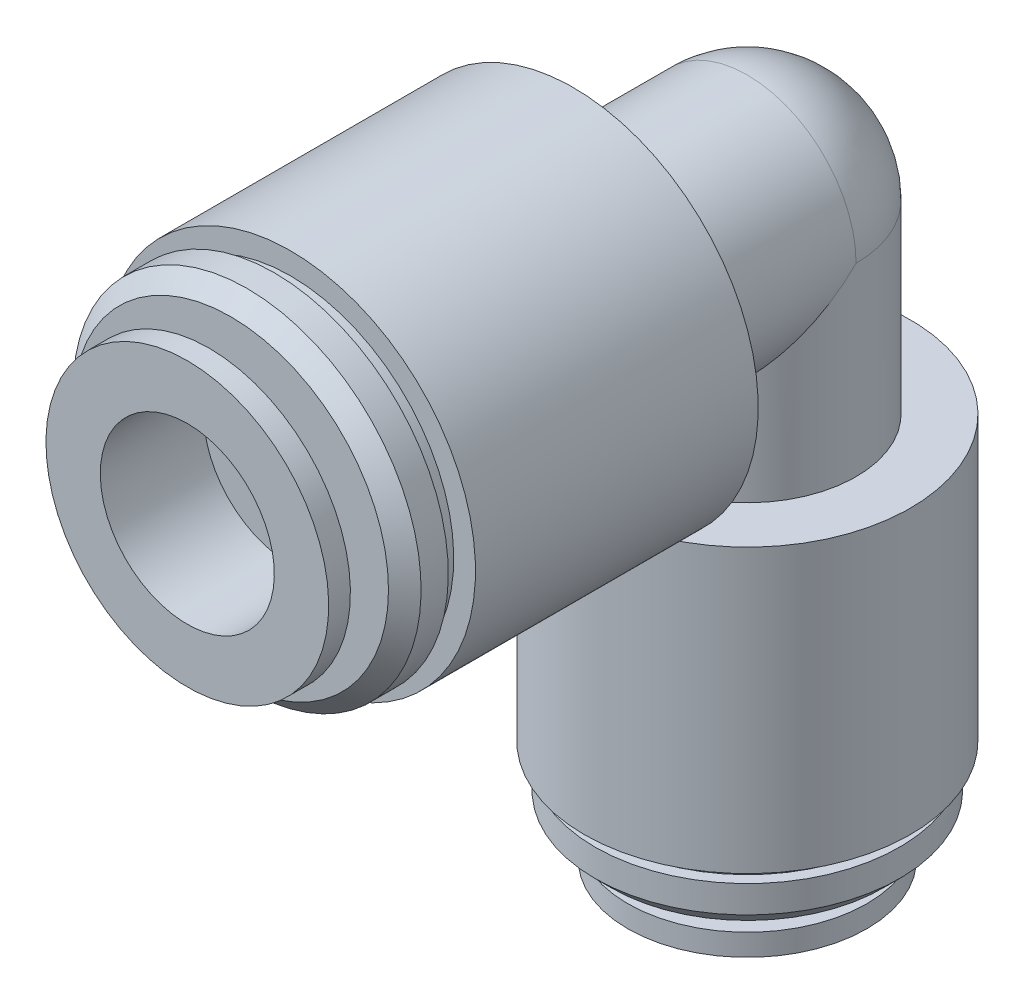
ISO-10303-21;
HEADER;
FILE_DESCRIPTION(('STEP AP214'),'2;1');
FILE_NAME('part.step','',(''),(''),'','','');
FILE_SCHEMA(('AUTOMOTIVE_DESIGN { 1 0 10303 214 1 1 1 1 }'));
ENDSEC;
DATA;
#1=APPLICATION_CONTEXT('core data for automotive mechanical design processes');
#2=APPLICATION_PROTOCOL_DEFINITION('international standard','automotive_design',2000,#1);
#3=PRODUCT_CONTEXT('',#1,'mechanical');
#4=PRODUCT('Part','Part','',(#3));
#5=PRODUCT_RELATED_PRODUCT_CATEGORY('part','',(#4));
#6=PRODUCT_DEFINITION_FORMATION('','',#4);
#7=PRODUCT_DEFINITION_CONTEXT('part definition',#1,'design');
#8=PRODUCT_DEFINITION('design','',#6,#7);
#9=PRODUCT_DEFINITION_SHAPE('','',#8);
#10=(LENGTH_UNIT() NAMED_UNIT(*) SI_UNIT(.MILLI.,.METRE.));
#11=(NAMED_UNIT(*) PLANE_ANGLE_UNIT() SI_UNIT($,.RADIAN.));
#12=(NAMED_UNIT(*) SI_UNIT($,.STERADIAN.) SOLID_ANGLE_UNIT());
#13=UNCERTAINTY_MEASURE_WITH_UNIT(LENGTH_MEASURE(1.E-05),#10,'distance_accuracy_value','');
#14=(GEOMETRIC_REPRESENTATION_CONTEXT(3) GLOBAL_UNCERTAINTY_ASSIGNED_CONTEXT((#13)) GLOBAL_UNIT_ASSIGNED_CONTEXT((#10,
#11,#12)) REPRESENTATION_CONTEXT('',''));
#15=CARTESIAN_POINT('',(0.,0.,0.));
#16=DIRECTION('',(0.,0.,1.));
#17=DIRECTION('',(1.,0.,0.));
#18=AXIS2_PLACEMENT_3D('',#15,#16,#17);
#19=CARTESIAN_POINT('',(0.,25.,0.));
#20=DIRECTION('',(0.,-1.,0.));
#21=DIRECTION('',(0.,0.,-1.));
#22=AXIS2_PLACEMENT_3D('',#19,#20,#21);
#23=CYLINDRICAL_SURFACE('',#22,5.);
#24=CARTESIAN_POINT('',(0.,30.,0.));
#25=DIRECTION('',(0.,-1.,0.));
#26=DIRECTION('',(0.,0.,-1.));
#27=AXIS2_PLACEMENT_3D('',#24,#25,#26);
#28=CIRCLE('',#27,5.);
#29=CARTESIAN_POINT('',(-5.,30.,0.));
#30=VERTEX_POINT('',#29);
#31=CARTESIAN_POINT('',(5.,30.,0.));
#32=VERTEX_POINT('',#31);
#33=EDGE_CURVE('E11',#30,#32,#28,.T.);
#34=ORIENTED_EDGE('',*,*,#33,.T.);
#35=CARTESIAN_POINT('',(0.,30.,0.));
#36=DIRECTION('',(0.,-0.707106781186547,-0.707106781186547));
#37=DIRECTION('',(0.,-0.707106781186547,0.707106781186547));
#38=AXIS2_PLACEMENT_3D('',#35,#36,#37);
#39=ELLIPSE('',#38,7.07106781186547,5.);
#40=EDGE_CURVE('E41',#32,#30,#39,.T.);
#41=ORIENTED_EDGE('',*,*,#40,.T.);
#42=EDGE_LOOP('',(#34,#41));
#43=FACE_BOUND('',#42,.T.);
#44=CARTESIAN_POINT('',(0.,21.5,0.));
#45=DIRECTION('',(0.,-1.,0.));
#46=DIRECTION('',(0.,0.,-1.));
#47=AXIS2_PLACEMENT_3D('',#44,#45,#46);
#48=CIRCLE('',#47,5.);
#49=CARTESIAN_POINT('',(0.,21.5,-5.));
#50=VERTEX_POINT('',#49);
#51=EDGE_CURVE('E248',#50,#50,#48,.T.);
#52=ORIENTED_EDGE('',*,*,#51,.F.);
#53=EDGE_LOOP('',(#52));
#54=FACE_BOUND('',#53,.T.);
#55=ADVANCED_FACE('F34',(#43,#54),#23,.T.);
#56=CARTESIAN_POINT('',(0.,30.,0.));
#57=DIRECTION('',(0.,-1.,0.));
#58=DIRECTION('',(1.,0.,0.));
#59=AXIS2_PLACEMENT_3D('',#56,#57,#58);
#60=SPHERICAL_SURFACE('',#59,5.);
#61=ORIENTED_EDGE('',*,*,#33,.F.);
#62=CARTESIAN_POINT('',(0.,30.,0.));
#63=DIRECTION('',(0.,0.,1.));
#64=DIRECTION('',(1.,0.,0.));
#65=AXIS2_PLACEMENT_3D('',#62,#63,#64);
#66=CIRCLE('',#65,5.);
#67=EDGE_CURVE('E48',#32,#30,#66,.T.);
#68=ORIENTED_EDGE('',*,*,#67,.F.);
#69=EDGE_LOOP('',(#61,#68));
#70=FACE_BOUND('',#69,.T.);
#71=ADVANCED_FACE('F58',(#70),#60,.T.);
#72=CARTESIAN_POINT('',(0.,30.,8.));
#73=DIRECTION('',(0.,0.,-1.));
#74=DIRECTION('',(-1.,0.,0.));
#75=AXIS2_PLACEMENT_3D('',#72,#73,#74);
#76=CYLINDRICAL_SURFACE('',#75,5.);
#77=ORIENTED_EDGE('',*,*,#40,.F.);
#78=ORIENTED_EDGE('',*,*,#67,.T.);
#79=EDGE_LOOP('',(#77,#78));
#80=FACE_BOUND('',#79,.T.);
#81=CARTESIAN_POINT('',(0.,30.,8.));
#82=DIRECTION('',(0.,0.,1.));
#83=DIRECTION('',(1.,0.,0.));
#84=AXIS2_PLACEMENT_3D('',#81,#82,#83);
#85=CIRCLE('',#84,5.);
#86=CARTESIAN_POINT('',(5.,30.,8.));
#87=VERTEX_POINT('',#86);
#88=EDGE_CURVE('E53',#87,#87,#85,.T.);
#89=ORIENTED_EDGE('',*,*,#88,.F.);
#90=EDGE_LOOP('',(#89));
#91=FACE_BOUND('',#90,.T.);
#92=ADVANCED_FACE('F49',(#80,#91),#76,.T.);
#93=CARTESIAN_POINT('',(0.,30.,21.));
#94=DIRECTION('',(0.,0.,-1.));
#95=DIRECTION('',(-1.,0.,0.));
#96=AXIS2_PLACEMENT_3D('',#93,#94,#95);
#97=CYLINDRICAL_SURFACE('',#96,8.5);
#98=CARTESIAN_POINT('',(0.,30.,21.));
#99=DIRECTION('',(0.,0.,1.));
#100=DIRECTION('',(1.,0.,0.));
#101=AXIS2_PLACEMENT_3D('',#98,#99,#100);
#102=CIRCLE('',#101,8.5);
#103=CARTESIAN_POINT('',(-8.5,30.,21.));
#104=VERTEX_POINT('',#103);
#105=EDGE_CURVE('E54',#104,#104,#102,.T.);
#106=CARTESIAN_POINT('',(0.,30.,8.));
#107=DIRECTION('',(0.,0.,1.));
#108=DIRECTION('',(1.,0.,0.));
#109=AXIS2_PLACEMENT_3D('',#106,#107,#108);
#110=CIRCLE('',#109,8.5);
#111=CARTESIAN_POINT('',(-8.5,30.,8.));
#112=VERTEX_POINT('',#111);
#113=EDGE_CURVE('E253',#112,#112,#110,.T.);
#114=CARTESIAN_POINT('',(-8.5,30.,21.));
#115=CARTESIAN_POINT('',(-8.5,30.,20.8645833333333));
#116=CARTESIAN_POINT('',(-8.5,30.,20.7291666666667));
#117=CARTESIAN_POINT('',(-8.5,30.,20.4583333333333));
#118=CARTESIAN_POINT('',(-8.5,30.,20.3229166666667));
#119=CARTESIAN_POINT('',(-8.5,30.,20.0520833333333));
#120=CARTESIAN_POINT('',(-8.5,30.,19.9166666666667));
#121=CARTESIAN_POINT('',(-8.5,30.,19.6458333333333));
#122=CARTESIAN_POINT('',(-8.5,30.,19.5104166666667));
#123=CARTESIAN_POINT('',(-8.5,30.,19.2395833333333));
#124=CARTESIAN_POINT('',(-8.5,30.,19.1041666666667));
#125=CARTESIAN_POINT('',(-8.5,30.,18.8333333333333));
#126=CARTESIAN_POINT('',(-8.5,30.,18.6979166666667));
#127=CARTESIAN_POINT('',(-8.5,30.,18.4270833333333));
#128=CARTESIAN_POINT('',(-8.5,30.,18.2916666666667));
#129=CARTESIAN_POINT('',(-8.5,30.,18.0208333333333));
#130=CARTESIAN_POINT('',(-8.5,30.,17.8854166666667));
#131=CARTESIAN_POINT('',(-8.5,30.,17.6145833333333));
#132=CARTESIAN_POINT('',(-8.5,30.,17.4791666666667));
#133=CARTESIAN_POINT('',(-8.5,30.,17.2083333333333));
#134=CARTESIAN_POINT('',(-8.5,30.,17.0729166666667));
#135=CARTESIAN_POINT('',(-8.5,30.,16.8020833333333));
#136=CARTESIAN_POINT('',(-8.5,30.,16.6666666666667));
#137=CARTESIAN_POINT('',(-8.5,30.,16.3958333333333));
#138=CARTESIAN_POINT('',(-8.5,30.,16.2604166666667));
#139=CARTESIAN_POINT('',(-8.5,30.,15.9895833333333));
#140=CARTESIAN_POINT('',(-8.5,30.,15.8541666666667));
#141=CARTESIAN_POINT('',(-8.5,30.,15.5833333333333));
#142=CARTESIAN_POINT('',(-8.5,30.,15.4479166666667));
#143=CARTESIAN_POINT('',(-8.5,30.,15.1770833333333));
#144=CARTESIAN_POINT('',(-8.5,30.,15.0416666666667));
#145=CARTESIAN_POINT('',(-8.5,30.,14.7708333333333));
#146=CARTESIAN_POINT('',(-8.5,30.,14.6354166666667));
#147=CARTESIAN_POINT('',(-8.5,30.,14.3645833333333));
#148=CARTESIAN_POINT('',(-8.5,30.,14.2291666666667));
#149=CARTESIAN_POINT('',(-8.5,30.,13.9583333333333));
#150=CARTESIAN_POINT('',(-8.5,30.,13.8229166666667));
#151=CARTESIAN_POINT('',(-8.5,30.,13.5520833333333));
#152=CARTESIAN_POINT('',(-8.5,30.,13.4166666666667));
#153=CARTESIAN_POINT('',(-8.5,30.,13.1458333333333));
#154=CARTESIAN_POINT('',(-8.5,30.,13.0104166666667));
#155=CARTESIAN_POINT('',(-8.5,30.,12.7395833333333));
#156=CARTESIAN_POINT('',(-8.5,30.,12.6041666666667));
#157=CARTESIAN_POINT('',(-8.5,30.,12.3333333333333));
#158=CARTESIAN_POINT('',(-8.5,30.,12.1979166666667));
#159=CARTESIAN_POINT('',(-8.5,30.,11.9270833333333));
#160=CARTESIAN_POINT('',(-8.5,30.,11.7916666666667));
#161=CARTESIAN_POINT('',(-8.5,30.,11.5208333333333));
#162=CARTESIAN_POINT('',(-8.5,30.,11.3854166666667));
#163=CARTESIAN_POINT('',(-8.5,30.,11.1145833333333));
#164=CARTESIAN_POINT('',(-8.5,30.,10.9791666666667));
#165=CARTESIAN_POINT('',(-8.5,30.,10.7083333333333));
#166=CARTESIAN_POINT('',(-8.5,30.,10.5729166666667));
#167=CARTESIAN_POINT('',(-8.5,30.,10.3020833333333));
#168=CARTESIAN_POINT('',(-8.5,30.,10.1666666666667));
#169=CARTESIAN_POINT('',(-8.5,30.,9.89583333333333));
#170=CARTESIAN_POINT('',(-8.5,30.,9.76041666666667));
#171=CARTESIAN_POINT('',(-8.5,30.,9.48958333333333));
#172=CARTESIAN_POINT('',(-8.5,30.,9.35416666666666));
#173=CARTESIAN_POINT('',(-8.5,30.,9.08333333333333));
#174=CARTESIAN_POINT('',(-8.5,30.,8.94791666666666));
#175=CARTESIAN_POINT('',(-8.5,30.,8.67708333333333));
#176=CARTESIAN_POINT('',(-8.5,30.,8.54166666666667));
#177=CARTESIAN_POINT('',(-8.5,30.,8.27083333333333));
#178=CARTESIAN_POINT('',(-8.5,30.,8.13541666666667));
#179=CARTESIAN_POINT('',(-8.5,30.,8.));
#180=B_SPLINE_CURVE_WITH_KNOTS('',3,(#114,#115,#116,#117,#118,#119,#120,#121,#122,#123,#124,
#125,#126,#127,#128,#129,#130,#131,#132,#133,#134,#135,#136,#137,#138,#139,#140,#141,#142,#143,
#144,#145,#146,#147,#148,#149,#150,#151,#152,#153,#154,#155,#156,#157,#158,#159,#160,#161,#162,
#163,#164,#165,#166,#167,#168,#169,#170,#171,#172,#173,#174,#175,#176,#177,#178,#179),
.UNSPECIFIED.,.F.,.F.,(4,2,2,2,2,2,2,2,2,2,2,2,2,2,2,2,2,2,2,2,2,2,2,2,2,2,2,2,2,2,2,2,4),(0.,
0.406249999999997,0.812499999999997,1.21875,1.625,2.03125,2.4375,2.84375,3.25,3.65625,4.0625,
4.46875,4.875,5.28125,5.6875,6.09375,6.5,6.90625,7.3125,7.71875,8.125,8.53124999999999,8.9375,
9.34375,9.75,10.15625,10.5625,10.96875,11.375,11.78125,12.1875,12.59375,13.),.UNSPECIFIED.);
#181=EDGE_CURVE('BSEAM64',#104,#112,#180,.T.);
#182=ORIENTED_EDGE('',*,*,#105,.F.);
#183=ORIENTED_EDGE('',*,*,#113,.T.);
#184=ORIENTED_EDGE('',*,*,#181,.T.);
#185=ORIENTED_EDGE('',*,*,#181,.F.);
#186=EDGE_LOOP('',(#182,#184,#183,#185));
#187=FACE_BOUND('',#186,.T.);
#188=ADVANCED_FACE('F64',(#187),#97,.T.);
#189=CARTESIAN_POINT('',(0.,30.,21.));
#190=DIRECTION('',(0.,0.,1.));
#191=DIRECTION('',(1.,0.,0.));
#192=AXIS2_PLACEMENT_3D('',#189,#190,#191);
#193=PLANE('',#192);
#194=CARTESIAN_POINT('',(0.,30.,21.));
#195=DIRECTION('',(0.,0.,-1.));
#196=DIRECTION('',(0.,1.,0.));
#197=AXIS2_PLACEMENT_3D('',#194,#195,#196);
#198=CIRCLE('',#197,7.49999999999996);
#199=CARTESIAN_POINT('',(0.,37.5,21.));
#200=VERTEX_POINT('',#199);
#201=EDGE_CURVE('E178',#200,#200,#198,.T.);
#202=ORIENTED_EDGE('',*,*,#201,.T.);
#203=EDGE_LOOP('',(#202));
#204=FACE_BOUND('',#203,.T.);
#205=ORIENTED_EDGE('',*,*,#105,.T.);
#206=EDGE_LOOP('',(#205));
#207=FACE_BOUND('',#206,.T.);
#208=ADVANCED_FACE('F69',(#204,#207),#193,.T.);
#209=CARTESIAN_POINT('',(0.,30.,8.));
#210=DIRECTION('',(0.,0.,1.));
#211=DIRECTION('',(1.,0.,0.));
#212=AXIS2_PLACEMENT_3D('',#209,#210,#211);
#213=PLANE('',#212);
#214=ORIENTED_EDGE('',*,*,#88,.T.);
#215=EDGE_LOOP('',(#214));
#216=FACE_BOUND('',#215,.T.);
#217=ORIENTED_EDGE('',*,*,#113,.F.);
#218=EDGE_LOOP('',(#217));
#219=FACE_BOUND('',#218,.T.);
#220=ADVANCED_FACE('F71',(#216,#219),#213,.F.);
#221=CARTESIAN_POINT('',(0.,8.5,0.));
#222=DIRECTION('',(0.,1.,0.));
#223=DIRECTION('',(0.,0.,1.));
#224=AXIS2_PLACEMENT_3D('',#221,#222,#223);
#225=CYLINDRICAL_SURFACE('',#224,7.5);
#226=CARTESIAN_POINT('',(0.,8.5,0.));
#227=DIRECTION('',(0.,-1.,0.));
#228=DIRECTION('',(0.,0.,-1.));
#229=AXIS2_PLACEMENT_3D('',#226,#227,#228);
#230=CIRCLE('',#229,7.5);
#231=CARTESIAN_POINT('',(0.,8.5,7.5));
#232=VERTEX_POINT('',#231);
#233=EDGE_CURVE('E245',#232,#232,#230,.T.);
#234=CARTESIAN_POINT('',(0.,21.5,0.));
#235=DIRECTION('',(0.,-1.,0.));
#236=DIRECTION('',(0.,0.,-1.));
#237=AXIS2_PLACEMENT_3D('',#234,#235,#236);
#238=CIRCLE('',#237,7.5);
#239=CARTESIAN_POINT('',(0.,21.5,7.5));
#240=VERTEX_POINT('',#239);
#241=EDGE_CURVE('E244',#240,#240,#238,.T.);
#242=CARTESIAN_POINT('',(0.,8.5,7.5));
#243=CARTESIAN_POINT('',(0.,8.63541666666667,7.5));
#244=CARTESIAN_POINT('',(0.,8.77083333333334,7.5));
#245=CARTESIAN_POINT('',(0.,9.04166666666667,7.5));
#246=CARTESIAN_POINT('',(0.,9.17708333333334,7.5));
#247=CARTESIAN_POINT('',(0.,9.44791666666667,7.5));
#248=CARTESIAN_POINT('',(0.,9.58333333333334,7.5));
#249=CARTESIAN_POINT('',(0.,9.85416666666667,7.5));
#250=CARTESIAN_POINT('',(0.,9.98958333333334,7.5));
#251=CARTESIAN_POINT('',(0.,10.2604166666667,7.5));
#252=CARTESIAN_POINT('',(0.,10.3958333333333,7.5));
#253=CARTESIAN_POINT('',(0.,10.6666666666667,7.5));
#254=CARTESIAN_POINT('',(0.,10.8020833333333,7.5));
#255=CARTESIAN_POINT('',(0.,11.0729166666667,7.5));
#256=CARTESIAN_POINT('',(0.,11.2083333333333,7.5));
#257=CARTESIAN_POINT('',(0.,11.4791666666667,7.5));
#258=CARTESIAN_POINT('',(0.,11.6145833333333,7.5));
#259=CARTESIAN_POINT('',(0.,11.8854166666667,7.5));
#260=CARTESIAN_POINT('',(0.,12.0208333333333,7.5));
#261=CARTESIAN_POINT('',(0.,12.2916666666667,7.5));
#262=CARTESIAN_POINT('',(0.,12.4270833333333,7.5));
#263=CARTESIAN_POINT('',(0.,12.6979166666667,7.5));
#264=CARTESIAN_POINT('',(0.,12.8333333333333,7.5));
#265=CARTESIAN_POINT('',(0.,13.1041666666667,7.5));
#266=CARTESIAN_POINT('',(0.,13.2395833333333,7.5));
#267=CARTESIAN_POINT('',(0.,13.5104166666667,7.5));
#268=CARTESIAN_POINT('',(0.,13.6458333333333,7.5));
#269=CARTESIAN_POINT('',(0.,13.9166666666667,7.5));
#270=CARTESIAN_POINT('',(0.,14.0520833333333,7.5));
#271=CARTESIAN_POINT('',(0.,14.3229166666667,7.5));
#272=CARTESIAN_POINT('',(0.,14.4583333333333,7.5));
#273=CARTESIAN_POINT('',(0.,14.7291666666667,7.5));
#274=CARTESIAN_POINT('',(0.,14.8645833333333,7.5));
#275=CARTESIAN_POINT('',(0.,15.1354166666667,7.5));
#276=CARTESIAN_POINT('',(0.,15.2708333333333,7.5));
#277=CARTESIAN_POINT('',(0.,15.5416666666667,7.5));
#278=CARTESIAN_POINT('',(0.,15.6770833333333,7.5));
#279=CARTESIAN_POINT('',(0.,15.9479166666667,7.5));
#280=CARTESIAN_POINT('',(0.,16.0833333333333,7.5));
#281=CARTESIAN_POINT('',(0.,16.3541666666667,7.5));
#282=CARTESIAN_POINT('',(0.,16.4895833333333,7.5));
#283=CARTESIAN_POINT('',(0.,16.7604166666667,7.5));
#284=CARTESIAN_POINT('',(0.,16.8958333333333,7.5));
#285=CARTESIAN_POINT('',(0.,17.1666666666667,7.5));
#286=CARTESIAN_POINT('',(0.,17.3020833333333,7.5));
#287=CARTESIAN_POINT('',(0.,17.5729166666667,7.5));
#288=CARTESIAN_POINT('',(0.,17.7083333333333,7.5));
#289=CARTESIAN_POINT('',(0.,17.9791666666667,7.5));
#290=CARTESIAN_POINT('',(0.,18.1145833333333,7.5));
#291=CARTESIAN_POINT('',(0.,18.3854166666667,7.5));
#292=CARTESIAN_POINT('',(0.,18.5208333333333,7.5));
#293=CARTESIAN_POINT('',(0.,18.7916666666667,7.5));
#294=CARTESIAN_POINT('',(0.,18.9270833333333,7.5));
#295=CARTESIAN_POINT('',(0.,19.1979166666667,7.5));
#296=CARTESIAN_POINT('',(0.,19.3333333333333,7.5));
#297=CARTESIAN_POINT('',(0.,19.6041666666667,7.5));
#298=CARTESIAN_POINT('',(0.,19.7395833333333,7.5));
#299=CARTESIAN_POINT('',(0.,20.0104166666667,7.5));
#300=CARTESIAN_POINT('',(0.,20.1458333333333,7.5));
#301=CARTESIAN_POINT('',(0.,20.4166666666667,7.5));
#302=CARTESIAN_POINT('',(0.,20.5520833333333,7.5));
#303=CARTESIAN_POINT('',(0.,20.8229166666667,7.5));
#304=CARTESIAN_POINT('',(0.,20.9583333333333,7.5));
#305=CARTESIAN_POINT('',(0.,21.2291666666667,7.5));
#306=CARTESIAN_POINT('',(0.,21.3645833333333,7.5));
#307=CARTESIAN_POINT('',(0.,21.5,7.5));
#308=B_SPLINE_CURVE_WITH_KNOTS('',3,(#242,#243,#244,#245,#246,#247,#248,#249,#250,#251,#252,
#253,#254,#255,#256,#257,#258,#259,#260,#261,#262,#263,#264,#265,#266,#267,#268,#269,#270,#271,
#272,#273,#274,#275,#276,#277,#278,#279,#280,#281,#282,#283,#284,#285,#286,#287,#288,#289,#290,
#291,#292,#293,#294,#295,#296,#297,#298,#299,#300,#301,#302,#303,#304,#305,#306,#307),
.UNSPECIFIED.,.F.,.F.,(4,2,2,2,2,2,2,2,2,2,2,2,2,2,2,2,2,2,2,2,2,2,2,2,2,2,2,2,2,2,2,2,4),(0.,
0.40625,0.812500000000001,1.21875,1.625,2.03125,2.4375,2.84375,3.25,3.65625,4.0625,4.46875,
4.875,5.28125,5.6875,6.09375,6.5,6.90625,7.3125,7.71875,8.125,8.53125,8.9375,9.34375,9.75,
10.15625,10.5625,10.96875,11.375,11.78125,12.1875,12.59375,13.),.UNSPECIFIED.);
#309=EDGE_CURVE('BSEAM74',#232,#240,#308,.T.);
#310=ORIENTED_EDGE('',*,*,#233,.F.);
#311=ORIENTED_EDGE('',*,*,#241,.T.);
#312=ORIENTED_EDGE('',*,*,#309,.T.);
#313=ORIENTED_EDGE('',*,*,#309,.F.);
#314=EDGE_LOOP('',(#310,#312,#311,#313));
#315=FACE_BOUND('',#314,.T.);
#316=ADVANCED_FACE('F74',(#315),#225,.T.);
#317=CARTESIAN_POINT('',(0.,8.5,0.));
#318=DIRECTION('',(0.,-1.,0.));
#319=DIRECTION('',(0.,0.,-1.));
#320=AXIS2_PLACEMENT_3D('',#317,#318,#319);
#321=PLANE('',#320);
#322=CARTESIAN_POINT('',(0.,8.5,0.));
#323=DIRECTION('',(0.,1.,0.));
#324=DIRECTION('',(0.,0.,1.));
#325=AXIS2_PLACEMENT_3D('',#322,#323,#324);
#326=CIRCLE('',#325,6.49999999999996);
#327=CARTESIAN_POINT('',(0.,8.49999999999998,6.49999999999996));
#328=VERTEX_POINT('',#327);
#329=EDGE_CURVE('E214',#328,#328,#326,.T.);
#330=ORIENTED_EDGE('',*,*,#329,.T.);
#331=EDGE_LOOP('',(#330));
#332=FACE_BOUND('',#331,.T.);
#333=ORIENTED_EDGE('',*,*,#233,.T.);
#334=EDGE_LOOP('',(#333));
#335=FACE_BOUND('',#334,.T.);
#336=ADVANCED_FACE('F82',(#332,#335),#321,.T.);
#337=CARTESIAN_POINT('',(0.,21.5,0.));
#338=DIRECTION('',(0.,-1.,0.));
#339=DIRECTION('',(0.,0.,-1.));
#340=AXIS2_PLACEMENT_3D('',#337,#338,#339);
#341=PLANE('',#340);
#342=ORIENTED_EDGE('',*,*,#51,.T.);
#343=EDGE_LOOP('',(#342));
#344=FACE_BOUND('',#343,.T.);
#345=ORIENTED_EDGE('',*,*,#241,.F.);
#346=EDGE_LOOP('',(#345));
#347=FACE_BOUND('',#346,.T.);
#348=ADVANCED_FACE('F84',(#344,#347),#341,.F.);
#349=CARTESIAN_POINT('',(0.,8.5,0.));
#350=DIRECTION('',(0.,1.,0.));
#351=DIRECTION('',(0.,0.,1.));
#352=AXIS2_PLACEMENT_3D('',#349,#350,#351);
#353=CYLINDRICAL_SURFACE('',#352,3.);
#354=CARTESIAN_POINT('',(0.,3.74999999999998,0.));
#355=DIRECTION('',(0.,1.,0.));
#356=DIRECTION('',(0.,0.,1.));
#357=AXIS2_PLACEMENT_3D('',#354,#355,#356);
#358=CIRCLE('',#357,3.);
#359=CARTESIAN_POINT('',(0.,3.74999999999997,2.99999999999999));
#360=VERTEX_POINT('',#359);
#361=EDGE_CURVE('E241',#360,#360,#358,.T.);
#362=ORIENTED_EDGE('',*,*,#361,.F.);
#363=EDGE_LOOP('',(#362));
#364=FACE_BOUND('',#363,.T.);
#365=CARTESIAN_POINT('',(0.,8.50000000000001,0.));
#366=DIRECTION('',(0.,1.,0.));
#367=DIRECTION('',(0.,0.,1.));
#368=AXIS2_PLACEMENT_3D('',#365,#366,#367);
#369=CIRCLE('',#368,3.);
#370=CARTESIAN_POINT('',(0.,8.5,3.));
#371=VERTEX_POINT('',#370);
#372=EDGE_CURVE('E211',#371,#371,#369,.T.);
#373=ORIENTED_EDGE('',*,*,#372,.T.);
#374=EDGE_LOOP('',(#373));
#375=FACE_BOUND('',#374,.T.);
#376=ADVANCED_FACE('F87',(#364,#375),#353,.F.);
#377=CARTESIAN_POINT('',(0.,3.74999999999999,-3.00000000000002));
#378=DIRECTION('',(0.,1.,0.));
#379=DIRECTION('',(0.,0.,1.));
#380=AXIS2_PLACEMENT_3D('',#377,#378,#379);
#381=PLANE('',#380);
#382=CARTESIAN_POINT('',(0.,3.74999999999998,0.));
#383=DIRECTION('',(0.,1.,0.));
#384=DIRECTION('',(0.,0.,1.));
#385=AXIS2_PLACEMENT_3D('',#382,#383,#384);
#386=CIRCLE('',#385,5.5);
#387=CARTESIAN_POINT('',(0.,3.74999999999997,5.49999999999999));
#388=VERTEX_POINT('',#387);
#389=EDGE_CURVE('E238',#388,#388,#386,.T.);
#390=ORIENTED_EDGE('',*,*,#389,.F.);
#391=EDGE_LOOP('',(#390));
#392=FACE_BOUND('',#391,.T.);
#393=ORIENTED_EDGE('',*,*,#361,.T.);
#394=EDGE_LOOP('',(#393));
#395=FACE_BOUND('',#394,.T.);
#396=ADVANCED_FACE('F95',(#392,#395),#381,.F.);
#397=CARTESIAN_POINT('',(0.,8.5,0.));
#398=DIRECTION('',(0.,1.,0.));
#399=DIRECTION('',(0.,0.,1.));
#400=AXIS2_PLACEMENT_3D('',#397,#398,#399);
#401=CYLINDRICAL_SURFACE('',#400,5.5);
#402=CARTESIAN_POINT('',(0.,4.75000000000007,0.));
#403=DIRECTION('',(0.,1.,0.));
#404=DIRECTION('',(0.,0.,1.));
#405=AXIS2_PLACEMENT_3D('',#402,#403,#404);
#406=CIRCLE('',#405,5.5);
#407=CARTESIAN_POINT('',(0.,4.75000000000005,5.49999999999999));
#408=VERTEX_POINT('',#407);
#409=EDGE_CURVE('E235',#408,#408,#406,.T.);
#410=ORIENTED_EDGE('',*,*,#409,.F.);
#411=EDGE_LOOP('',(#410));
#412=FACE_BOUND('',#411,.T.);
#413=ORIENTED_EDGE('',*,*,#389,.T.);
#414=EDGE_LOOP('',(#413));
#415=FACE_BOUND('',#414,.T.);
#416=ADVANCED_FACE('F99',(#412,#415),#401,.T.);
#417=CARTESIAN_POINT('',(0.,4.75000000000008,-5.50000000000001));
#418=DIRECTION('',(0.,-1.,0.));
#419=DIRECTION('',(0.,0.,-1.));
#420=AXIS2_PLACEMENT_3D('',#417,#418,#419);
#421=PLANE('',#420);
#422=CARTESIAN_POINT('',(0.,4.75000000000007,0.));
#423=DIRECTION('',(0.,1.,0.));
#424=DIRECTION('',(0.,0.,1.));
#425=AXIS2_PLACEMENT_3D('',#422,#423,#424);
#426=CIRCLE('',#425,3.49999999999998);
#427=CARTESIAN_POINT('',(0.,4.75000000000006,3.49999999999997));
#428=VERTEX_POINT('',#427);
#429=EDGE_CURVE('E232',#428,#428,#426,.T.);
#430=ORIENTED_EDGE('',*,*,#429,.F.);
#431=EDGE_LOOP('',(#430));
#432=FACE_BOUND('',#431,.T.);
#433=ORIENTED_EDGE('',*,*,#409,.T.);
#434=EDGE_LOOP('',(#433));
#435=FACE_BOUND('',#434,.T.);
#436=ADVANCED_FACE('F103',(#432,#435),#421,.F.);
#437=CARTESIAN_POINT('',(0.,8.5,0.));
#438=DIRECTION('',(0.,1.,0.));
#439=DIRECTION('',(0.,0.,1.));
#440=AXIS2_PLACEMENT_3D('',#437,#438,#439);
#441=CYLINDRICAL_SURFACE('',#440,3.49999999999998);
#442=CARTESIAN_POINT('',(0.,5.75000000000003,0.));
#443=DIRECTION('',(0.,1.,0.));
#444=DIRECTION('',(0.,0.,1.));
#445=AXIS2_PLACEMENT_3D('',#442,#443,#444);
#446=CIRCLE('',#445,3.49999999999998);
#447=CARTESIAN_POINT('',(0.,5.75000000000002,3.49999999999998));
#448=VERTEX_POINT('',#447);
#449=EDGE_CURVE('E229',#448,#448,#446,.T.);
#450=ORIENTED_EDGE('',*,*,#449,.F.);
#451=EDGE_LOOP('',(#450));
#452=FACE_BOUND('',#451,.T.);
#453=ORIENTED_EDGE('',*,*,#429,.T.);
#454=EDGE_LOOP('',(#453));
#455=FACE_BOUND('',#454,.T.);
#456=ADVANCED_FACE('F107',(#452,#455),#441,.T.);
#457=CARTESIAN_POINT('',(0.,5.75000000000004,-3.49999999999999));
#458=DIRECTION('',(0.,1.,0.));
#459=DIRECTION('',(0.,0.,1.));
#460=AXIS2_PLACEMENT_3D('',#457,#458,#459);
#461=PLANE('',#460);
#462=CARTESIAN_POINT('',(0.,5.75000000000003,0.));
#463=DIRECTION('',(0.,1.,0.));
#464=DIRECTION('',(0.,0.,1.));
#465=AXIS2_PLACEMENT_3D('',#462,#463,#464);
#466=CIRCLE('',#465,6.24999999999998);
#467=CARTESIAN_POINT('',(0.,5.75000000000001,6.24999999999997));
#468=VERTEX_POINT('',#467);
#469=EDGE_CURVE('E226',#468,#468,#466,.T.);
#470=ORIENTED_EDGE('',*,*,#469,.F.);
#471=EDGE_LOOP('',(#470));
#472=FACE_BOUND('',#471,.T.);
#473=ORIENTED_EDGE('',*,*,#449,.T.);
#474=EDGE_LOOP('',(#473));
#475=FACE_BOUND('',#474,.T.);
#476=ADVANCED_FACE('F111',(#472,#475),#461,.F.);
#477=CARTESIAN_POINT('',(0.,5.75000000000003,0.));
#478=DIRECTION('',(0.,1.,0.));
#479=DIRECTION('',(0.,0.,1.));
#480=AXIS2_PLACEMENT_3D('',#477,#478,#479);
#481=CONICAL_SURFACE('',#480,6.24999999999998,0.785398163397448);
#482=CARTESIAN_POINT('',(0.,6.50000000000003,0.));
#483=DIRECTION('',(0.,1.,0.));
#484=DIRECTION('',(0.,0.,1.));
#485=AXIS2_PLACEMENT_3D('',#482,#483,#484);
#486=CIRCLE('',#485,6.99999999999998);
#487=CARTESIAN_POINT('',(0.,6.50000000000001,6.99999999999997));
#488=VERTEX_POINT('',#487);
#489=EDGE_CURVE('E223',#488,#488,#486,.T.);
#490=ORIENTED_EDGE('',*,*,#489,.F.);
#491=EDGE_LOOP('',(#490));
#492=FACE_BOUND('',#491,.T.);
#493=ORIENTED_EDGE('',*,*,#469,.T.);
#494=EDGE_LOOP('',(#493));
#495=FACE_BOUND('',#494,.T.);
#496=ADVANCED_FACE('F115',(#492,#495),#481,.T.);
#497=CARTESIAN_POINT('',(0.,8.5,0.));
#498=DIRECTION('',(0.,1.,0.));
#499=DIRECTION('',(0.,0.,1.));
#500=AXIS2_PLACEMENT_3D('',#497,#498,#499);
#501=CYLINDRICAL_SURFACE('',#500,6.99999999999998);
#502=CARTESIAN_POINT('',(0.,7.75000000000001,0.));
#503=DIRECTION('',(0.,1.,0.));
#504=DIRECTION('',(0.,0.,1.));
#505=AXIS2_PLACEMENT_3D('',#502,#503,#504);
#506=CIRCLE('',#505,6.99999999999998);
#507=CARTESIAN_POINT('',(0.,7.74999999999999,6.99999999999998));
#508=VERTEX_POINT('',#507);
#509=EDGE_CURVE('E220',#508,#508,#506,.T.);
#510=ORIENTED_EDGE('',*,*,#509,.F.);
#511=EDGE_LOOP('',(#510));
#512=FACE_BOUND('',#511,.T.);
#513=ORIENTED_EDGE('',*,*,#489,.T.);
#514=EDGE_LOOP('',(#513));
#515=FACE_BOUND('',#514,.T.);
#516=ADVANCED_FACE('F119',(#512,#515),#501,.T.);
#517=CARTESIAN_POINT('',(0.,7.75000000000003,-6.99999999999998));
#518=DIRECTION('',(0.,-1.,0.));
#519=DIRECTION('',(0.,0.,-1.));
#520=AXIS2_PLACEMENT_3D('',#517,#518,#519);
#521=PLANE('',#520);
#522=CARTESIAN_POINT('',(0.,7.75000000000001,0.));
#523=DIRECTION('',(0.,1.,0.));
#524=DIRECTION('',(0.,0.,1.));
#525=AXIS2_PLACEMENT_3D('',#522,#523,#524);
#526=CIRCLE('',#525,6.49999999999996);
#527=CARTESIAN_POINT('',(0.,7.74999999999999,6.49999999999996));
#528=VERTEX_POINT('',#527);
#529=EDGE_CURVE('E217',#528,#528,#526,.T.);
#530=ORIENTED_EDGE('',*,*,#529,.F.);
#531=EDGE_LOOP('',(#530));
#532=FACE_BOUND('',#531,.T.);
#533=ORIENTED_EDGE('',*,*,#509,.T.);
#534=EDGE_LOOP('',(#533));
#535=FACE_BOUND('',#534,.T.);
#536=ADVANCED_FACE('F123',(#532,#535),#521,.F.);
#537=CARTESIAN_POINT('',(0.,8.5,0.));
#538=DIRECTION('',(0.,1.,0.));
#539=DIRECTION('',(0.,0.,1.));
#540=AXIS2_PLACEMENT_3D('',#537,#538,#539);
#541=CYLINDRICAL_SURFACE('',#540,6.49999999999996);
#542=ORIENTED_EDGE('',*,*,#329,.F.);
#543=EDGE_LOOP('',(#542));
#544=FACE_BOUND('',#543,.T.);
#545=ORIENTED_EDGE('',*,*,#529,.T.);
#546=EDGE_LOOP('',(#545));
#547=FACE_BOUND('',#546,.T.);
#548=ADVANCED_FACE('F127',(#544,#547),#541,.T.);
#549=ORIENTED_EDGE('',*,*,#372,.F.);
#550=EDGE_LOOP('',(#549));
#551=FACE_BOUND('',#550,.T.);
#552=ADVANCED_FACE('F92',(#551),#321,.T.);
#553=CARTESIAN_POINT('',(0.,30.,21.));
#554=DIRECTION('',(0.,0.,-1.));
#555=DIRECTION('',(0.,1.,0.));
#556=AXIS2_PLACEMENT_3D('',#553,#554,#555);
#557=CYLINDRICAL_SURFACE('',#556,4.);
#558=CARTESIAN_POINT('',(0.,30.,25.75));
#559=DIRECTION('',(0.,0.,-1.));
#560=DIRECTION('',(0.,1.,0.));
#561=AXIS2_PLACEMENT_3D('',#558,#559,#560);
#562=CIRCLE('',#561,4.);
#563=CARTESIAN_POINT('',(0.,34.,25.75));
#564=VERTEX_POINT('',#563);
#565=EDGE_CURVE('E208',#564,#564,#562,.T.);
#566=ORIENTED_EDGE('',*,*,#565,.F.);
#567=EDGE_LOOP('',(#566));
#568=FACE_BOUND('',#567,.T.);
#569=CARTESIAN_POINT('',(0.,30.,21.));
#570=DIRECTION('',(0.,0.,-1.));
#571=DIRECTION('',(0.,1.,0.));
#572=AXIS2_PLACEMENT_3D('',#569,#570,#571);
#573=CIRCLE('',#572,4.);
#574=CARTESIAN_POINT('',(0.,34.,21.));
#575=VERTEX_POINT('',#574);
#576=EDGE_CURVE('E187',#575,#575,#573,.T.);
#577=ORIENTED_EDGE('',*,*,#576,.T.);
#578=EDGE_LOOP('',(#577));
#579=FACE_BOUND('',#578,.T.);
#580=ADVANCED_FACE('F132',(#568,#579),#557,.F.);
#581=CARTESIAN_POINT('',(0.,26.,25.75));
#582=DIRECTION('',(0.,0.,-1.));
#583=DIRECTION('',(0.,1.,0.));
#584=AXIS2_PLACEMENT_3D('',#581,#582,#583);
#585=PLANE('',#584);
#586=CARTESIAN_POINT('',(0.,30.,25.75));
#587=DIRECTION('',(0.,0.,-1.));
#588=DIRECTION('',(0.,1.,0.));
#589=AXIS2_PLACEMENT_3D('',#586,#587,#588);
#590=CIRCLE('',#589,6.5);
#591=CARTESIAN_POINT('',(0.,36.5,25.75));
#592=VERTEX_POINT('',#591);
#593=EDGE_CURVE('E205',#592,#592,#590,.T.);
#594=ORIENTED_EDGE('',*,*,#593,.F.);
#595=EDGE_LOOP('',(#594));
#596=FACE_BOUND('',#595,.T.);
#597=ORIENTED_EDGE('',*,*,#565,.T.);
#598=EDGE_LOOP('',(#597));
#599=FACE_BOUND('',#598,.T.);
#600=ADVANCED_FACE('F135',(#596,#599),#585,.F.);
#601=CARTESIAN_POINT('',(0.,30.,21.));
#602=DIRECTION('',(0.,0.,-1.));
#603=DIRECTION('',(0.,1.,0.));
#604=AXIS2_PLACEMENT_3D('',#601,#602,#603);
#605=CYLINDRICAL_SURFACE('',#604,6.5);
#606=CARTESIAN_POINT('',(0.,30.,24.7499999999999));
#607=DIRECTION('',(0.,0.,-1.));
#608=DIRECTION('',(0.,1.,0.));
#609=AXIS2_PLACEMENT_3D('',#606,#607,#608);
#610=CIRCLE('',#609,6.5);
#611=CARTESIAN_POINT('',(0.,36.5,24.7499999999999));
#612=VERTEX_POINT('',#611);
#613=EDGE_CURVE('E202',#612,#612,#610,.T.);
#614=ORIENTED_EDGE('',*,*,#613,.F.);
#615=EDGE_LOOP('',(#614));
#616=FACE_BOUND('',#615,.T.);
#617=ORIENTED_EDGE('',*,*,#593,.T.);
#618=EDGE_LOOP('',(#617));
#619=FACE_BOUND('',#618,.T.);
#620=ADVANCED_FACE('F139',(#616,#619),#605,.T.);
#621=CARTESIAN_POINT('',(0.,23.5,24.7499999999999));
#622=DIRECTION('',(0.,0.,1.));
#623=DIRECTION('',(0.,-1.,0.));
#624=AXIS2_PLACEMENT_3D('',#621,#622,#623);
#625=PLANE('',#624);
#626=CARTESIAN_POINT('',(0.,30.,24.7499999999999));
#627=DIRECTION('',(0.,0.,-1.));
#628=DIRECTION('',(0.,1.,0.));
#629=AXIS2_PLACEMENT_3D('',#626,#627,#628);
#630=CIRCLE('',#629,4.49999999999998);
#631=CARTESIAN_POINT('',(0.,34.5,24.7499999999999));
#632=VERTEX_POINT('',#631);
#633=EDGE_CURVE('E199',#632,#632,#630,.T.);
#634=ORIENTED_EDGE('',*,*,#633,.F.);
#635=EDGE_LOOP('',(#634));
#636=FACE_BOUND('',#635,.T.);
#637=ORIENTED_EDGE('',*,*,#613,.T.);
#638=EDGE_LOOP('',(#637));
#639=FACE_BOUND('',#638,.T.);
#640=ADVANCED_FACE('F143',(#636,#639),#625,.F.);
#641=CARTESIAN_POINT('',(0.,30.,21.));
#642=DIRECTION('',(0.,0.,-1.));
#643=DIRECTION('',(0.,1.,0.));
#644=AXIS2_PLACEMENT_3D('',#641,#642,#643);
#645=CYLINDRICAL_SURFACE('',#644,4.49999999999998);
#646=CARTESIAN_POINT('',(0.,30.,23.75));
#647=DIRECTION('',(0.,0.,-1.));
#648=DIRECTION('',(0.,1.,0.));
#649=AXIS2_PLACEMENT_3D('',#646,#647,#648);
#650=CIRCLE('',#649,4.49999999999998);
#651=CARTESIAN_POINT('',(0.,34.5,23.75));
#652=VERTEX_POINT('',#651);
#653=EDGE_CURVE('E196',#652,#652,#650,.T.);
#654=ORIENTED_EDGE('',*,*,#653,.F.);
#655=EDGE_LOOP('',(#654));
#656=FACE_BOUND('',#655,.T.);
#657=ORIENTED_EDGE('',*,*,#633,.T.);
#658=EDGE_LOOP('',(#657));
#659=FACE_BOUND('',#658,.T.);
#660=ADVANCED_FACE('F147',(#656,#659),#645,.T.);
#661=CARTESIAN_POINT('',(0.,25.5,23.75));
#662=DIRECTION('',(0.,0.,-1.));
#663=DIRECTION('',(0.,1.,0.));
#664=AXIS2_PLACEMENT_3D('',#661,#662,#663);
#665=PLANE('',#664);
#666=CARTESIAN_POINT('',(0.,30.,23.75));
#667=DIRECTION('',(0.,0.,-1.));
#668=DIRECTION('',(0.,1.,0.));
#669=AXIS2_PLACEMENT_3D('',#666,#667,#668);
#670=CIRCLE('',#669,7.24999999999998);
#671=CARTESIAN_POINT('',(0.,37.25,23.75));
#672=VERTEX_POINT('',#671);
#673=EDGE_CURVE('E193',#672,#672,#670,.T.);
#674=ORIENTED_EDGE('',*,*,#673,.F.);
#675=EDGE_LOOP('',(#674));
#676=FACE_BOUND('',#675,.T.);
#677=ORIENTED_EDGE('',*,*,#653,.T.);
#678=EDGE_LOOP('',(#677));
#679=FACE_BOUND('',#678,.T.);
#680=ADVANCED_FACE('F151',(#676,#679),#665,.F.);
#681=CARTESIAN_POINT('',(0.,30.,23.75));
#682=DIRECTION('',(0.,0.,-1.));
#683=DIRECTION('',(0.,1.,0.));
#684=AXIS2_PLACEMENT_3D('',#681,#682,#683);
#685=CONICAL_SURFACE('',#684,7.24999999999998,0.785398163397448);
#686=CARTESIAN_POINT('',(0.,30.,23.));
#687=DIRECTION('',(0.,0.,-1.));
#688=DIRECTION('',(0.,1.,0.));
#689=AXIS2_PLACEMENT_3D('',#686,#687,#688);
#690=CIRCLE('',#689,7.99999999999998);
#691=CARTESIAN_POINT('',(0.,38.,23.));
#692=VERTEX_POINT('',#691);
#693=EDGE_CURVE('E185',#692,#692,#690,.T.);
#694=ORIENTED_EDGE('',*,*,#693,.F.);
#695=EDGE_LOOP('',(#694));
#696=FACE_BOUND('',#695,.T.);
#697=ORIENTED_EDGE('',*,*,#673,.T.);
#698=EDGE_LOOP('',(#697));
#699=FACE_BOUND('',#698,.T.);
#700=ADVANCED_FACE('F155',(#696,#699),#685,.T.);
#701=CARTESIAN_POINT('',(0.,30.,21.));
#702=DIRECTION('',(0.,0.,-1.));
#703=DIRECTION('',(0.,1.,0.));
#704=AXIS2_PLACEMENT_3D('',#701,#702,#703);
#705=CYLINDRICAL_SURFACE('',#704,7.99999999999998);
#706=CARTESIAN_POINT('',(0.,30.,21.75));
#707=DIRECTION('',(0.,0.,-1.));
#708=DIRECTION('',(0.,1.,0.));
#709=AXIS2_PLACEMENT_3D('',#706,#707,#708);
#710=CIRCLE('',#709,7.99999999999998);
#711=CARTESIAN_POINT('',(0.,38.,21.75));
#712=VERTEX_POINT('',#711);
#713=EDGE_CURVE('E182',#712,#712,#710,.T.);
#714=ORIENTED_EDGE('',*,*,#713,.F.);
#715=EDGE_LOOP('',(#714));
#716=FACE_BOUND('',#715,.T.);
#717=ORIENTED_EDGE('',*,*,#693,.T.);
#718=EDGE_LOOP('',(#717));
#719=FACE_BOUND('',#718,.T.);
#720=ADVANCED_FACE('F159',(#716,#719),#705,.T.);
#721=CARTESIAN_POINT('',(0.,22.,21.75));
#722=DIRECTION('',(0.,0.,1.));
#723=DIRECTION('',(0.,-1.,0.));
#724=AXIS2_PLACEMENT_3D('',#721,#722,#723);
#725=PLANE('',#724);
#726=CARTESIAN_POINT('',(0.,30.,21.75));
#727=DIRECTION('',(0.,0.,-1.));
#728=DIRECTION('',(0.,1.,0.));
#729=AXIS2_PLACEMENT_3D('',#726,#727,#728);
#730=CIRCLE('',#729,7.49999999999996);
#731=CARTESIAN_POINT('',(0.,37.5,21.75));
#732=VERTEX_POINT('',#731);
#733=EDGE_CURVE('E181',#732,#732,#730,.T.);
#734=ORIENTED_EDGE('',*,*,#733,.F.);
#735=EDGE_LOOP('',(#734));
#736=FACE_BOUND('',#735,.T.);
#737=ORIENTED_EDGE('',*,*,#713,.T.);
#738=EDGE_LOOP('',(#737));
#739=FACE_BOUND('',#738,.T.);
#740=ADVANCED_FACE('F163',(#736,#739),#725,.F.);
#741=CARTESIAN_POINT('',(0.,30.,21.));
#742=DIRECTION('',(0.,0.,-1.));
#743=DIRECTION('',(0.,1.,0.));
#744=AXIS2_PLACEMENT_3D('',#741,#742,#743);
#745=CYLINDRICAL_SURFACE('',#744,7.49999999999996);
#746=ORIENTED_EDGE('',*,*,#201,.F.);
#747=EDGE_LOOP('',(#746));
#748=FACE_BOUND('',#747,.T.);
#749=ORIENTED_EDGE('',*,*,#733,.T.);
#750=EDGE_LOOP('',(#749));
#751=FACE_BOUND('',#750,.T.);
#752=ADVANCED_FACE('F167',(#748,#751),#745,.T.);
#753=ORIENTED_EDGE('',*,*,#576,.F.);
#754=EDGE_LOOP('',(#753));
#755=FACE_BOUND('',#754,.T.);
#756=ADVANCED_FACE('F79',(#755),#193,.T.);
#757=CLOSED_SHELL('',(#55,#71,#92,#188,#208,#220,#316,#336,#348,#376,#396,#416,#436,#456,#476,
#496,#516,#536,#548,#552,#580,#600,#620,#640,#660,#680,#700,#720,#740,#752,#756));
#758=MANIFOLD_SOLID_BREP('B2',#757);
#759=ADVANCED_BREP_SHAPE_REPRESENTATION('',(#18,#758),#14);
#760=SHAPE_DEFINITION_REPRESENTATION(#9,#759);
ENDSEC;
END-ISO-10303-21;
